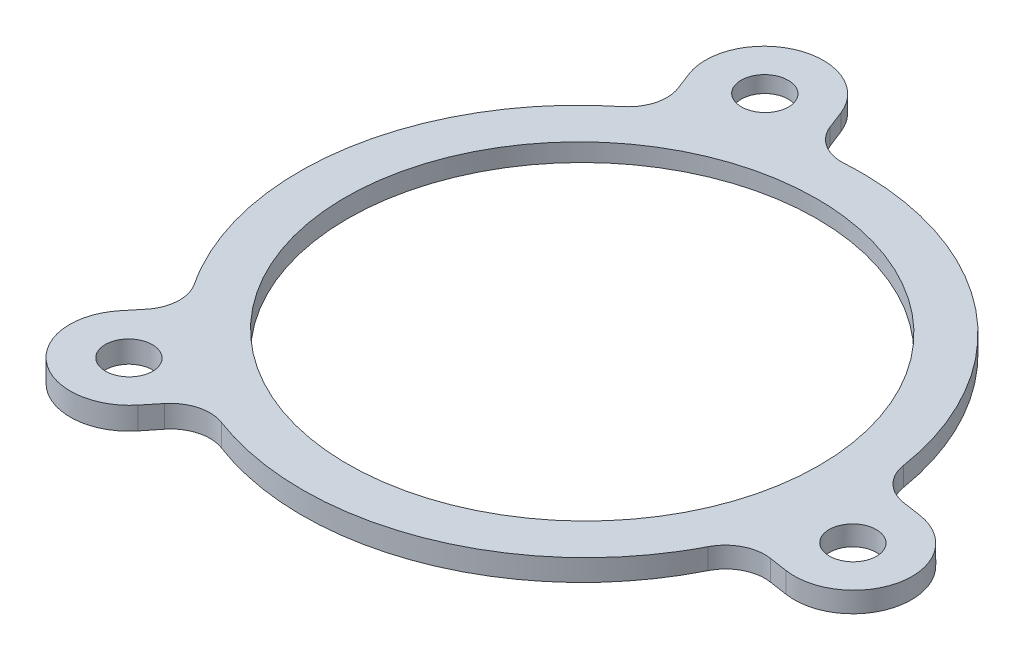
ISO-10303-21;
HEADER;
FILE_DESCRIPTION(('STEP AP214'),'2;1');
FILE_NAME('part.step','',(''),(''),'','','');
FILE_SCHEMA(('AUTOMOTIVE_DESIGN { 1 0 10303 214 1 1 1 1 }'));
ENDSEC;
DATA;
#1=APPLICATION_CONTEXT('core data for automotive mechanical design processes');
#2=APPLICATION_PROTOCOL_DEFINITION('international standard','automotive_design',2000,#1);
#3=PRODUCT_CONTEXT('',#1,'mechanical');
#4=PRODUCT('Part','Part','',(#3));
#5=PRODUCT_RELATED_PRODUCT_CATEGORY('part','',(#4));
#6=PRODUCT_DEFINITION_FORMATION('','',#4);
#7=PRODUCT_DEFINITION_CONTEXT('part definition',#1,'design');
#8=PRODUCT_DEFINITION('design','',#6,#7);
#9=PRODUCT_DEFINITION_SHAPE('','',#8);
#10=(LENGTH_UNIT() NAMED_UNIT(*) SI_UNIT(.MILLI.,.METRE.));
#11=(NAMED_UNIT(*) PLANE_ANGLE_UNIT() SI_UNIT($,.RADIAN.));
#12=(NAMED_UNIT(*) SI_UNIT($,.STERADIAN.) SOLID_ANGLE_UNIT());
#13=UNCERTAINTY_MEASURE_WITH_UNIT(LENGTH_MEASURE(1.E-05),#10,'distance_accuracy_value','');
#14=(GEOMETRIC_REPRESENTATION_CONTEXT(3) GLOBAL_UNCERTAINTY_ASSIGNED_CONTEXT((#13)) GLOBAL_UNIT_ASSIGNED_CONTEXT((#10,
#11,#12)) REPRESENTATION_CONTEXT('',''));
#15=CARTESIAN_POINT('',(0.,0.,0.));
#16=DIRECTION('',(0.,0.,1.));
#17=DIRECTION('',(1.,0.,0.));
#18=AXIS2_PLACEMENT_3D('',#15,#16,#17);
#19=CARTESIAN_POINT('',(-6.0204669415708,48.9962951753156,-15.3624209617317));
#20=DIRECTION('',(0.,-1.,0.));
#21=DIRECTION('',(0.,0.,-1.));
#22=AXIS2_PLACEMENT_3D('',#19,#20,#21);
#23=CYLINDRICAL_SURFACE('',#22,1.2);
#24=CARTESIAN_POINT('',(-6.0204669415708,0.,-15.3624209617317));
#25=DIRECTION('',(0.,1.,0.));
#26=DIRECTION('',(0.,0.,1.));
#27=AXIS2_PLACEMENT_3D('',#24,#25,#26);
#28=CIRCLE('',#27,1.2);
#29=CARTESIAN_POINT('',(-6.0204669415708,0.,-14.1624209617317));
#30=VERTEX_POINT('',#29);
#31=EDGE_CURVE('E244',#30,#30,#28,.T.);
#32=ORIENTED_EDGE('',*,*,#31,.F.);
#33=EDGE_LOOP('',(#32));
#34=FACE_BOUND('',#33,.T.);
#35=CARTESIAN_POINT('',(-6.0204669415708,0.847163806580779,-15.3624209617317));
#36=DIRECTION('',(0.,0.999950515308284,-0.00994821263836066));
#37=DIRECTION('',(0.,-0.00994821263836066,-0.999950515308284));
#38=AXIS2_PLACEMENT_3D('',#35,#36,#37);
#39=ELLIPSE('',#38,1.20005938456869,1.2);
#40=CARTESIAN_POINT('',(-6.0204669415708,0.83522536064443,-16.5624209617317));
#41=VERTEX_POINT('',#40);
#42=EDGE_CURVE('E191',#41,#41,#39,.T.);
#43=ORIENTED_EDGE('',*,*,#42,.T.);
#44=EDGE_LOOP('',(#43));
#45=FACE_BOUND('',#44,.T.);
#46=ADVANCED_FACE('F41',(#34,#45),#23,.F.);
#47=CARTESIAN_POINT('',(-3.22729949398321,48.9962951753156,-16.4570513147446));
#48=DIRECTION('',(-0.931055815862527,0.,0.364876784337624));
#49=DIRECTION('',(0.364876784337624,0.,0.931055815862527));
#50=AXIS2_PLACEMENT_3D('',#47,#48,#49);
#51=PLANE('',#50);
#52=DIRECTION('',(-0.364861132229939,-0.00926240225514885,-0.931015876391134));
#53=VECTOR('',#52,1.);
#54=CARTESIAN_POINT('',(-3.06454315520295,0.8404054013402,-16.0417460876254));
#55=LINE('',#54,#53);
#56=CARTESIAN_POINT('',(-2.87443070108355,0.845231615667291,-15.5566362815929));
#57=VERTEX_POINT('',#56);
#58=CARTESIAN_POINT('',(-3.22729949398322,0.836273652172661,-16.4570513147446));
#59=VERTEX_POINT('',#58);
#60=EDGE_CURVE('E170',#57,#59,#55,.T.);
#61=ORIENTED_EDGE('',*,*,#60,.F.);
#62=DIRECTION('',(0.,-1.,0.));
#63=VECTOR('',#62,1.);
#64=CARTESIAN_POINT('',(-2.87443070108355,48.9962951753156,-15.5566362815929));
#65=LINE('',#64,#63);
#66=CARTESIAN_POINT('',(-2.87443070108355,0.,-15.5566362815929));
#67=VERTEX_POINT('',#66);
#68=EDGE_CURVE('E57',#57,#67,#65,.T.);
#69=ORIENTED_EDGE('',*,*,#68,.T.);
#70=DIRECTION('',(-0.364876784337624,0.,-0.931055815862527));
#71=VECTOR('',#70,1.);
#72=CARTESIAN_POINT('',(-3.22729949398321,0.,-16.4570513147446));
#73=LINE('',#72,#71);
#74=CARTESIAN_POINT('',(-3.22729949398321,0.,-16.4570513147446));
#75=VERTEX_POINT('',#74);
#76=EDGE_CURVE('E173',#67,#75,#73,.T.);
#77=ORIENTED_EDGE('',*,*,#76,.T.);
#78=DIRECTION('',(0.,-1.,0.));
#79=VECTOR('',#78,1.);
#80=CARTESIAN_POINT('',(-3.22729949398321,48.9962951753156,-16.4570513147446));
#81=LINE('',#80,#79);
#82=EDGE_CURVE('E166',#59,#75,#81,.T.);
#83=ORIENTED_EDGE('',*,*,#82,.F.);
#84=EDGE_LOOP('',(#61,#69,#77,#83));
#85=FACE_BOUND('',#84,.T.);
#86=ADVANCED_FACE('F168',(#85),#51,.F.);
#87=CARTESIAN_POINT('',(-1.0123190693585,48.9962951753156,-16.2863898502682));
#88=DIRECTION('',(0.,-1.,0.));
#89=DIRECTION('',(0.,0.,-1.));
#90=AXIS2_PLACEMENT_3D('',#87,#88,#89);
#91=CYLINDRICAL_SURFACE('',#90,2.);
#92=CARTESIAN_POINT('',(-1.0123190693585,0.837971512728561,-16.2863898502682));
#93=DIRECTION('',(0.,0.999950515308284,-0.00994821263836066));
#94=DIRECTION('',(0.,-0.00994821263836066,-0.999950515308284));
#95=AXIS2_PLACEMENT_3D('',#92,#93,#94);
#96=ELLIPSE('',#95,2.00009897428114,2.);
#97=CARTESIAN_POINT('',(-0.888243794181388,0.857830596443614,-14.2902422289511));
#98=VERTEX_POINT('',#97);
#99=EDGE_CURVE('E185',#98,#57,#96,.F.);
#100=ORIENTED_EDGE('',*,*,#99,.F.);
#101=DIRECTION('',(0.,-1.,0.));
#102=VECTOR('',#101,1.);
#103=CARTESIAN_POINT('',(-0.888243794181388,48.9962951753156,-14.2902422289511));
#104=LINE('',#103,#102);
#105=CARTESIAN_POINT('',(-0.888243794181388,0.,-14.2902422289511));
#106=VERTEX_POINT('',#105);
#107=EDGE_CURVE('E304',#98,#106,#104,.T.);
#108=ORIENTED_EDGE('',*,*,#107,.T.);
#109=CARTESIAN_POINT('',(-1.0123190693585,0.,-16.2863898502682));
#110=DIRECTION('',(0.,-1.,0.));
#111=DIRECTION('',(0.,0.,-1.));
#112=AXIS2_PLACEMENT_3D('',#109,#110,#111);
#113=CIRCLE('',#112,2.);
#114=EDGE_CURVE('E300',#106,#67,#113,.T.);
#115=ORIENTED_EDGE('',*,*,#114,.T.);
#116=ORIENTED_EDGE('',*,*,#68,.F.);
#117=EDGE_LOOP('',(#100,#108,#115,#116));
#118=FACE_BOUND('',#117,.T.);
#119=ADVANCED_FACE('F394',(#118),#91,.F.);
#120=CARTESIAN_POINT('',(0.,48.9962951753156,0.));
#121=DIRECTION('',(0.,-1.,0.));
#122=DIRECTION('',(0.,0.,-1.));
#123=AXIS2_PLACEMENT_3D('',#120,#121,#122);
#124=CYLINDRICAL_SURFACE('',#123,14.3178210632764);
#125=CARTESIAN_POINT('',(0.,1.00000000000001,0.));
#126=DIRECTION('',(0.,0.999950515308284,-0.00994821263836066));
#127=DIRECTION('',(0.,-0.00994821263836066,-0.999950515308284));
#128=AXIS2_PLACEMENT_3D('',#125,#126,#127);
#129=ELLIPSE('',#128,14.3185296113,14.3178210632764);
#130=CARTESIAN_POINT('',(14.1319095605525,0.977119855603566,-2.29981133408054));
#131=VERTEX_POINT('',#130);
#132=EDGE_CURVE('E188',#131,#98,#129,.T.);
#133=ORIENTED_EDGE('',*,*,#132,.F.);
#134=DIRECTION('',(0.,-1.,0.));
#135=VECTOR('',#134,1.);
#136=CARTESIAN_POINT('',(14.1319095605525,48.9962951753156,-2.29981133408054));
#137=LINE('',#136,#135);
#138=CARTESIAN_POINT('',(14.1319095605525,0.,-2.29981133408054));
#139=VERTEX_POINT('',#138);
#140=EDGE_CURVE('E306',#131,#139,#137,.T.);
#141=ORIENTED_EDGE('',*,*,#140,.T.);
#142=CARTESIAN_POINT('',(0.,0.,0.));
#143=DIRECTION('',(0.,1.,0.));
#144=DIRECTION('',(0.,0.,-1.));
#145=AXIS2_PLACEMENT_3D('',#142,#143,#144);
#146=CIRCLE('',#145,14.3178210632764);
#147=EDGE_CURVE('E297',#139,#106,#146,.T.);
#148=ORIENTED_EDGE('',*,*,#147,.T.);
#149=ORIENTED_EDGE('',*,*,#107,.F.);
#150=EDGE_LOOP('',(#133,#141,#148,#149));
#151=FACE_BOUND('',#150,.T.);
#152=ADVANCED_FACE('F391',(#151),#124,.T.);
#153=CARTESIAN_POINT('',(16.1059403153856,48.9962951753156,-2.62106291613576));
#154=DIRECTION('',(0.,-1.,0.));
#155=DIRECTION('',(0.,0.,-1.));
#156=AXIS2_PLACEMENT_3D('',#153,#154,#155);
#157=CYLINDRICAL_SURFACE('',#156,2.);
#158=CARTESIAN_POINT('',(16.1059403153856,0.97392381839996,-2.62106291613576));
#159=DIRECTION('',(0.,0.999950515308284,-0.00994821263836066));
#160=DIRECTION('',(0.,-0.00994821263836066,-0.999950515308284));
#161=AXIS2_PLACEMENT_3D('',#158,#159,#160);
#162=ELLIPSE('',#161,2.00009897428114,2.);
#163=CARTESIAN_POINT('',(15.8068696284982,0.993597509398876,-0.643550154041748));
#164=VERTEX_POINT('',#163);
#165=EDGE_CURVE('E196',#164,#131,#162,.F.);
#166=ORIENTED_EDGE('',*,*,#165,.F.);
#167=DIRECTION('',(0.,-1.,0.));
#168=VECTOR('',#167,1.);
#169=CARTESIAN_POINT('',(15.8068696284982,48.9962951753156,-0.643550154041748));
#170=LINE('',#169,#168);
#171=CARTESIAN_POINT('',(15.8068696284982,0.,-0.643550154041748));
#172=VERTEX_POINT('',#171);
#173=EDGE_CURVE('E308',#164,#172,#170,.T.);
#174=ORIENTED_EDGE('',*,*,#173,.T.);
#175=CARTESIAN_POINT('',(16.1059403153856,0.,-2.62106291613576));
#176=DIRECTION('',(0.,-1.,0.));
#177=DIRECTION('',(0.,0.,-1.));
#178=AXIS2_PLACEMENT_3D('',#175,#176,#177);
#179=CIRCLE('',#178,2.);
#180=EDGE_CURVE('E294',#172,#139,#179,.T.);
#181=ORIENTED_EDGE('',*,*,#180,.T.);
#182=ORIENTED_EDGE('',*,*,#140,.F.);
#183=EDGE_LOOP('',(#166,#174,#181,#182));
#184=FACE_BOUND('',#183,.T.);
#185=ADVANCED_FACE('F387',(#184),#157,.F.);
#186=CARTESIAN_POINT('',(16.7630863176067,48.9962951753156,-0.498935976319788));
#187=DIRECTION('',(-0.149535343443711,0.,0.988756381047006));
#188=DIRECTION('',(0.988756381047006,0.,0.149535343443711));
#189=AXIS2_PLACEMENT_3D('',#186,#187,#188);
#190=PLANE('',#189);
#191=DIRECTION('',(-0.988755286890644,-0.00148768136479566,-0.149535177968119));
#192=VECTOR('',#191,1.);
#193=CARTESIAN_POINT('',(16.8336939045544,0.995142469370929,-0.488257582767704));
#194=LINE('',#193,#192);
#195=CARTESIAN_POINT('',(16.7630863176067,0.995036233184182,-0.498935976319788));
#196=VERTEX_POINT('',#195);
#197=EDGE_CURVE('E199',#196,#164,#194,.T.);
#198=ORIENTED_EDGE('',*,*,#197,.F.);
#199=DIRECTION('',(0.,-1.,0.));
#200=VECTOR('',#199,1.);
#201=CARTESIAN_POINT('',(16.7630863176067,48.9962951753156,-0.498935976319787));
#202=LINE('',#201,#200);
#203=CARTESIAN_POINT('',(16.7630863176067,0.,-0.498935976319787));
#204=VERTEX_POINT('',#203);
#205=EDGE_CURVE('E310',#196,#204,#202,.T.);
#206=ORIENTED_EDGE('',*,*,#205,.T.);
#207=DIRECTION('',(-0.988756381047006,0.,-0.149535343443711));
#208=VECTOR('',#207,1.);
#209=CARTESIAN_POINT('',(16.7630863176067,0.,-0.498935976319788));
#210=LINE('',#209,#208);
#211=EDGE_CURVE('E291',#204,#172,#210,.T.);
#212=ORIENTED_EDGE('',*,*,#211,.T.);
#213=ORIENTED_EDGE('',*,*,#173,.F.);
#214=EDGE_LOOP('',(#198,#206,#212,#213));
#215=FACE_BOUND('',#214,.T.);
#216=ADVANCED_FACE('F384',(#215),#190,.F.);
#217=CARTESIAN_POINT('',(16.3144802872756,48.9962951753156,2.46733316682123));
#218=DIRECTION('',(0.,-1.,0.));
#219=DIRECTION('',(0.,0.,-1.));
#220=AXIS2_PLACEMENT_3D('',#217,#218,#219);
#221=CYLINDRICAL_SURFACE('',#220,3.);
#222=CARTESIAN_POINT('',(16.3144802872756,1.02454676968255,2.46733316682123));
#223=DIRECTION('',(0.,0.999950515308284,-0.00994821263836066));
#224=DIRECTION('',(0.,-0.00994821263836066,-0.999950515308284));
#225=AXIS2_PLACEMENT_3D('',#222,#223,#224);
#226=ELLIPSE('',#225,3.00014846142171,3.);
#227=CARTESIAN_POINT('',(15.8658742569445,1.05405730618093,5.43360230996224));
#228=VERTEX_POINT('',#227);
#229=EDGE_CURVE('E202',#228,#196,#226,.T.);
#230=ORIENTED_EDGE('',*,*,#229,.F.);
#231=DIRECTION('',(0.,-1.,0.));
#232=VECTOR('',#231,1.);
#233=CARTESIAN_POINT('',(15.8658742569445,48.9962951753156,5.43360230996224));
#234=LINE('',#233,#232);
#235=CARTESIAN_POINT('',(15.8658742569445,0.,5.43360230996224));
#236=VERTEX_POINT('',#235);
#237=EDGE_CURVE('E312',#228,#236,#234,.T.);
#238=ORIENTED_EDGE('',*,*,#237,.T.);
#239=CARTESIAN_POINT('',(16.3144802872756,0.,2.46733316682123));
#240=DIRECTION('',(0.,1.,0.));
#241=DIRECTION('',(0.,0.,-1.));
#242=AXIS2_PLACEMENT_3D('',#239,#240,#241);
#243=CIRCLE('',#242,3.);
#244=EDGE_CURVE('E288',#236,#204,#243,.T.);
#245=ORIENTED_EDGE('',*,*,#244,.T.);
#246=ORIENTED_EDGE('',*,*,#205,.F.);
#247=EDGE_LOOP('',(#230,#238,#245,#246));
#248=FACE_BOUND('',#247,.T.);
#249=ADVANCED_FACE('F379',(#248),#221,.T.);
#250=CARTESIAN_POINT('',(15.8658742569445,48.9962951753156,5.43360230996224));
#251=DIRECTION('',(0.149535343443709,0.,-0.988756381047006));
#252=DIRECTION('',(-0.988756381047006,0.,-0.149535343443709));
#253=AXIS2_PLACEMENT_3D('',#250,#251,#252);
#254=PLANE('',#253);
#255=DIRECTION('',(0.988755286890644,0.00148768136479565,0.149535177968118));
#256=VECTOR('',#255,1.);
#257=CARTESIAN_POINT('',(15.9363950266787,1.05416341174249,5.44426757364525));
#258=LINE('',#257,#256);
#259=CARTESIAN_POINT('',(14.9096575678359,1.05261858239563,5.28898813224028));
#260=VERTEX_POINT('',#259);
#261=EDGE_CURVE('E205',#260,#228,#258,.T.);
#262=ORIENTED_EDGE('',*,*,#261,.F.);
#263=DIRECTION('',(0.,-1.,0.));
#264=VECTOR('',#263,1.);
#265=CARTESIAN_POINT('',(14.9096575678359,48.9962951753156,5.28898813224028));
#266=LINE('',#265,#264);
#267=CARTESIAN_POINT('',(14.9096575678359,0.,5.28898813224028));
#268=VERTEX_POINT('',#267);
#269=EDGE_CURVE('E314',#260,#268,#266,.T.);
#270=ORIENTED_EDGE('',*,*,#269,.T.);
#271=DIRECTION('',(0.988756381047006,0.,0.149535343443709));
#272=VECTOR('',#271,1.);
#273=CARTESIAN_POINT('',(15.8658742569445,0.,5.43360230996224));
#274=LINE('',#273,#272);
#275=EDGE_CURVE('E284',#268,#236,#274,.T.);
#276=ORIENTED_EDGE('',*,*,#275,.T.);
#277=ORIENTED_EDGE('',*,*,#237,.F.);
#278=EDGE_LOOP('',(#262,#270,#276,#277));
#279=FACE_BOUND('',#278,.T.);
#280=ADVANCED_FACE('F375',(#279),#254,.F.);
#281=CARTESIAN_POINT('',(14.6105868809485,48.9962951753156,7.2665008943343));
#282=DIRECTION('',(0.,-1.,0.));
#283=DIRECTION('',(0.,0.,-1.));
#284=AXIS2_PLACEMENT_3D('',#281,#282,#283);
#285=CYLINDRICAL_SURFACE('',#284,2.);
#286=CARTESIAN_POINT('',(14.6105868809485,1.07229227339455,7.2665008943343));
#287=DIRECTION('',(0.,0.999950515308284,-0.00994821263836066));
#288=DIRECTION('',(0.,-0.00994821263836066,-0.999950515308284));
#289=AXIS2_PLACEMENT_3D('',#286,#287,#288);
#290=ELLIPSE('',#289,2.00009897428114,2.);
#291=CARTESIAN_POINT('',(12.8198346935955,1.06343174316637,6.37587942396069));
#292=VERTEX_POINT('',#291);
#293=EDGE_CURVE('E209',#292,#260,#290,.F.);
#294=ORIENTED_EDGE('',*,*,#293,.F.);
#295=DIRECTION('',(0.,-1.,0.));
#296=VECTOR('',#295,1.);
#297=CARTESIAN_POINT('',(12.8198346935955,48.9962951753156,6.37587942396069));
#298=LINE('',#297,#296);
#299=CARTESIAN_POINT('',(12.8198346935955,0.,6.37587942396069));
#300=VERTEX_POINT('',#299);
#301=EDGE_CURVE('E316',#292,#300,#298,.T.);
#302=ORIENTED_EDGE('',*,*,#301,.T.);
#303=CARTESIAN_POINT('',(14.6105868809485,0.,7.2665008943343));
#304=DIRECTION('',(0.,-1.,0.));
#305=DIRECTION('',(0.,0.,-1.));
#306=AXIS2_PLACEMENT_3D('',#303,#304,#305);
#307=CIRCLE('',#306,2.);
#308=EDGE_CURVE('E281',#300,#268,#307,.T.);
#309=ORIENTED_EDGE('',*,*,#308,.T.);
#310=ORIENTED_EDGE('',*,*,#269,.F.);
#311=EDGE_LOOP('',(#294,#302,#309,#310));
#312=FACE_BOUND('',#311,.T.);
#313=ADVANCED_FACE('F372',(#312),#285,.F.);
#314=CARTESIAN_POINT('',(0.,48.9962951753156,0.));
#315=DIRECTION('',(0.,-1.,0.));
#316=DIRECTION('',(0.,0.,-1.));
#317=AXIS2_PLACEMENT_3D('',#314,#315,#316);
#318=CYLINDRICAL_SURFACE('',#317,14.3178210632764);
#319=CARTESIAN_POINT('',(0.,1.00000000000001,0.));
#320=DIRECTION('',(0.,0.999950515308284,-0.00994821263836066));
#321=DIRECTION('',(0.,-0.00994821263836066,-0.999950515308284));
#322=AXIS2_PLACEMENT_3D('',#319,#320,#321);
#323=ELLIPSE('',#322,14.3185296113,14.3178210632764);
#324=CARTESIAN_POINT('',(-5.07425974105116,1.13319821977159,13.3884983504629));
#325=VERTEX_POINT('',#324);
#326=EDGE_CURVE('E212',#325,#292,#323,.T.);
#327=ORIENTED_EDGE('',*,*,#326,.F.);
#328=DIRECTION('',(0.,-1.,0.));
#329=VECTOR('',#328,1.);
#330=CARTESIAN_POINT('',(-5.07425974105116,48.9962951753156,13.3884983504629));
#331=LINE('',#330,#329);
#332=CARTESIAN_POINT('',(-5.07425974105116,0.,13.3884983504629));
#333=VERTEX_POINT('',#332);
#334=EDGE_CURVE('E318',#325,#333,#331,.T.);
#335=ORIENTED_EDGE('',*,*,#334,.T.);
#336=CARTESIAN_POINT('',(0.,0.,0.));
#337=DIRECTION('',(0.,1.,0.));
#338=DIRECTION('',(0.,0.,-1.));
#339=AXIS2_PLACEMENT_3D('',#336,#337,#338);
#340=CIRCLE('',#339,14.3178210632764);
#341=EDGE_CURVE('E278',#333,#300,#340,.T.);
#342=ORIENTED_EDGE('',*,*,#341,.T.);
#343=ORIENTED_EDGE('',*,*,#301,.F.);
#344=EDGE_LOOP('',(#327,#335,#342,#343));
#345=FACE_BOUND('',#344,.T.);
#346=ADVANCED_FACE('F367',(#345),#318,.T.);
#347=CARTESIAN_POINT('',(-5.78306308740197,48.9962951753156,15.2586849230277));
#348=DIRECTION('',(0.,-1.,0.));
#349=DIRECTION('',(0.,0.,-1.));
#350=AXIS2_PLACEMENT_3D('',#347,#348,#349);
#351=CYLINDRICAL_SURFACE('',#350,2.);
#352=CARTESIAN_POINT('',(-5.78306308740197,1.1518041541778,15.2586849230277));
#353=DIRECTION('',(0.,0.999950515308284,-0.00994821263836066));
#354=DIRECTION('',(0.,-0.00994821263836066,-0.999950515308284));
#355=AXIS2_PLACEMENT_3D('',#352,#353,#354);
#356=ELLIPSE('',#355,2.00009897428114,2.);
#357=CARTESIAN_POINT('',(-7.3461040322396,1.13939056611763,14.010925729609));
#358=VERTEX_POINT('',#357);
#359=EDGE_CURVE('E215',#358,#325,#356,.F.);
#360=ORIENTED_EDGE('',*,*,#359,.F.);
#361=DIRECTION('',(0.,-1.,0.));
#362=VECTOR('',#361,1.);
#363=CARTESIAN_POINT('',(-7.3461040322396,48.9962951753156,14.010925729609));
#364=LINE('',#363,#362);
#365=CARTESIAN_POINT('',(-7.3461040322396,0.,14.010925729609));
#366=VERTEX_POINT('',#365);
#367=EDGE_CURVE('E320',#358,#366,#364,.T.);
#368=ORIENTED_EDGE('',*,*,#367,.T.);
#369=CARTESIAN_POINT('',(-5.78306308740197,0.,15.2586849230277));
#370=DIRECTION('',(0.,-1.,0.));
#371=DIRECTION('',(0.,0.,-1.));
#372=AXIS2_PLACEMENT_3D('',#369,#370,#371);
#373=CIRCLE('',#372,2.);
#374=EDGE_CURVE('E275',#366,#333,#373,.T.);
#375=ORIENTED_EDGE('',*,*,#374,.T.);
#376=ORIENTED_EDGE('',*,*,#334,.F.);
#377=EDGE_LOOP('',(#360,#368,#375,#376));
#378=FACE_BOUND('',#377,.T.);
#379=ADVANCED_FACE('F363',(#378),#351,.F.);
#380=CARTESIAN_POINT('',(-7.94945192844849,48.9962951753156,14.7667265850386));
#381=DIRECTION('',(-0.781520472418816,0.,-0.62387959670939));
#382=DIRECTION('',(-0.62387959670939,0.,0.781520472418816));
#383=AXIS2_PLACEMENT_3D('',#380,#381,#382);
#384=PLANE('',#383);
#385=DIRECTION('',(0.623860740043018,-0.00777488158837998,-0.781496851080838));
#386=VECTOR('',#385,1.);
#387=CARTESIAN_POINT('',(-8.1815426630215,1.14980224297397,15.0574616266784));
#388=LINE('',#387,#386);
#389=CARTESIAN_POINT('',(-7.94945192844849,1.14690980582695,14.7667265850386));
#390=VERTEX_POINT('',#389);
#391=EDGE_CURVE('E218',#390,#358,#388,.T.);
#392=ORIENTED_EDGE('',*,*,#391,.F.);
#393=DIRECTION('',(0.,-1.,0.));
#394=VECTOR('',#393,1.);
#395=CARTESIAN_POINT('',(-7.94945192844849,48.9962951753156,14.7667265850386));
#396=LINE('',#395,#394);
#397=CARTESIAN_POINT('',(-7.94945192844849,0.,14.7667265850386));
#398=VERTEX_POINT('',#397);
#399=EDGE_CURVE('E322',#390,#398,#396,.T.);
#400=ORIENTED_EDGE('',*,*,#399,.T.);
#401=DIRECTION('',(0.62387959670939,0.,-0.781520472418816));
#402=VECTOR('',#401,1.);
#403=CARTESIAN_POINT('',(-7.94945192844849,0.,14.7667265850386));
#404=LINE('',#403,#402);
#405=EDGE_CURVE('E271',#398,#366,#404,.T.);
#406=ORIENTED_EDGE('',*,*,#405,.T.);
#407=ORIENTED_EDGE('',*,*,#367,.F.);
#408=EDGE_LOOP('',(#392,#400,#406,#407));
#409=FACE_BOUND('',#408,.T.);
#410=ADVANCED_FACE('F360',(#409),#384,.F.);
#411=CARTESIAN_POINT('',(-10.2940133457049,48.9962951753156,12.8950877949105));
#412=DIRECTION('',(0.,-1.,0.));
#413=DIRECTION('',(0.,0.,-1.));
#414=AXIS2_PLACEMENT_3D('',#411,#412,#413);
#415=CYLINDRICAL_SURFACE('',#414,3.);
#416=CARTESIAN_POINT('',(-10.2940133457049,1.12828942373668,12.8950877949105));
#417=DIRECTION('',(0.,0.999950515308284,-0.00994821263836066));
#418=DIRECTION('',(0.,-0.00994821263836066,-0.999950515308284));
#419=AXIS2_PLACEMENT_3D('',#416,#417,#418);
#420=ELLIPSE('',#419,3.00014846142172,3.);
#421=CARTESIAN_POINT('',(-12.6385747629614,1.10966904164642,11.0234490047823));
#422=VERTEX_POINT('',#421);
#423=EDGE_CURVE('E222',#422,#390,#420,.T.);
#424=ORIENTED_EDGE('',*,*,#423,.F.);
#425=DIRECTION('',(0.,-1.,0.));
#426=VECTOR('',#425,1.);
#427=CARTESIAN_POINT('',(-12.6385747629614,48.9962951753156,11.0234490047823));
#428=LINE('',#427,#426);
#429=CARTESIAN_POINT('',(-12.6385747629614,0.,11.0234490047823));
#430=VERTEX_POINT('',#429);
#431=EDGE_CURVE('E324',#422,#430,#428,.T.);
#432=ORIENTED_EDGE('',*,*,#431,.T.);
#433=CARTESIAN_POINT('',(-10.2940133457049,0.,12.8950877949105));
#434=DIRECTION('',(0.,1.,0.));
#435=DIRECTION('',(0.,0.,-1.));
#436=AXIS2_PLACEMENT_3D('',#433,#434,#435);
#437=CIRCLE('',#436,3.);
#438=EDGE_CURVE('E268',#430,#398,#437,.T.);
#439=ORIENTED_EDGE('',*,*,#438,.T.);
#440=ORIENTED_EDGE('',*,*,#399,.F.);
#441=EDGE_LOOP('',(#424,#432,#439,#440));
#442=FACE_BOUND('',#441,.T.);
#443=ADVANCED_FACE('F355',(#442),#415,.T.);
#444=CARTESIAN_POINT('',(-12.6385747629614,48.9962951753156,11.0234490047823));
#445=DIRECTION('',(0.781520472418816,0.,0.623879596709389));
#446=DIRECTION('',(0.623879596709389,0.,-0.781520472418816));
#447=AXIS2_PLACEMENT_3D('',#444,#445,#446);
#448=PLANE('',#447);
#449=DIRECTION('',(-0.623860740043017,0.00777488158837999,0.781496851080838));
#450=VECTOR('',#449,1.);
#451=CARTESIAN_POINT('',(-12.8708461317525,1.11256372995233,11.3144103229989));
#452=LINE('',#451,#450);
#453=CARTESIAN_POINT('',(-12.0352268667525,1.10214980193709,10.2676481493526));
#454=VERTEX_POINT('',#453);
#455=EDGE_CURVE('E225',#454,#422,#452,.T.);
#456=ORIENTED_EDGE('',*,*,#455,.F.);
#457=DIRECTION('',(0.,-1.,0.));
#458=VECTOR('',#457,1.);
#459=CARTESIAN_POINT('',(-12.0352268667525,48.9962951753156,10.2676481493526));
#460=LINE('',#459,#458);
#461=CARTESIAN_POINT('',(-12.0352268667525,0.,10.2676481493526));
#462=VERTEX_POINT('',#461);
#463=EDGE_CURVE('E326',#454,#462,#460,.T.);
#464=ORIENTED_EDGE('',*,*,#463,.T.);
#465=DIRECTION('',(-0.623879596709389,0.,0.781520472418816));
#466=VECTOR('',#465,1.);
#467=CARTESIAN_POINT('',(-12.6385747629614,0.,11.0234490047823));
#468=LINE('',#467,#466);
#469=EDGE_CURVE('E264',#462,#430,#468,.T.);
#470=ORIENTED_EDGE('',*,*,#469,.T.);
#471=ORIENTED_EDGE('',*,*,#431,.F.);
#472=EDGE_LOOP('',(#456,#464,#470,#471));
#473=FACE_BOUND('',#472,.T.);
#474=ADVANCED_FACE('F351',(#473),#448,.F.);
#475=CARTESIAN_POINT('',(-13.5982678115901,48.9962951753156,9.01988895593385));
#476=DIRECTION('',(0.,-1.,0.));
#477=DIRECTION('',(0.,0.,-1.));
#478=AXIS2_PLACEMENT_3D('',#475,#476,#477);
#479=CYLINDRICAL_SURFACE('',#478,2.);
#480=CARTESIAN_POINT('',(-13.5982678115901,1.08973621387692,9.01988895593385));
#481=DIRECTION('',(0.,0.999950515308284,-0.00994821263836066));
#482=DIRECTION('',(0.,-0.00994821263836066,-0.999950515308284));
#483=AXIS2_PLACEMENT_3D('',#480,#481,#482);
#484=ELLIPSE('',#483,2.00009897428114,2.);
#485=CARTESIAN_POINT('',(-11.9315908994142,1.07873766039003,7.91436280499041));
#486=VERTEX_POINT('',#485);
#487=EDGE_CURVE('E229',#486,#454,#484,.F.);
#488=ORIENTED_EDGE('',*,*,#487,.F.);
#489=DIRECTION('',(0.,-1.,0.));
#490=VECTOR('',#489,1.);
#491=CARTESIAN_POINT('',(-11.9315908994142,48.9962951753156,7.91436280499041));
#492=LINE('',#491,#490);
#493=CARTESIAN_POINT('',(-11.9315908994142,0.,7.91436280499041));
#494=VERTEX_POINT('',#493);
#495=EDGE_CURVE('E328',#486,#494,#492,.T.);
#496=ORIENTED_EDGE('',*,*,#495,.T.);
#497=CARTESIAN_POINT('',(-13.5982678115901,0.,9.01988895593385));
#498=DIRECTION('',(0.,-1.,0.));
#499=DIRECTION('',(0.,0.,-1.));
#500=AXIS2_PLACEMENT_3D('',#497,#498,#499);
#501=CIRCLE('',#500,2.);
#502=EDGE_CURVE('E261',#494,#462,#501,.T.);
#503=ORIENTED_EDGE('',*,*,#502,.T.);
#504=ORIENTED_EDGE('',*,*,#463,.F.);
#505=EDGE_LOOP('',(#488,#496,#503,#504));
#506=FACE_BOUND('',#505,.T.);
#507=ADVANCED_FACE('F349',(#506),#479,.F.);
#508=CARTESIAN_POINT('',(0.,48.9962951753156,0.));
#509=DIRECTION('',(0.,-1.,0.));
#510=DIRECTION('',(0.,0.,-1.));
#511=AXIS2_PLACEMENT_3D('',#508,#509,#510);
#512=CYLINDRICAL_SURFACE('',#511,14.3178210632764);
#513=CARTESIAN_POINT('',(0.,1.00000000000001,0.));
#514=DIRECTION('',(0.,0.999950515308284,-0.00994821263836066));
#515=DIRECTION('',(0.,-0.00994821263836066,-0.999950515308284));
#516=AXIS2_PLACEMENT_3D('',#513,#514,#515);
#517=ELLIPSE('',#516,14.3185296113,14.3178210632764);
#518=CARTESIAN_POINT('',(-9.05764981950144,0.889681924624859,-11.0886870163823));
#519=VERTEX_POINT('',#518);
#520=EDGE_CURVE('E232',#519,#486,#517,.T.);
#521=ORIENTED_EDGE('',*,*,#520,.F.);
#522=DIRECTION('',(0.,-1.,0.));
#523=VECTOR('',#522,1.);
#524=CARTESIAN_POINT('',(-9.05764981950144,48.9962951753156,-11.0886870163823));
#525=LINE('',#524,#523);
#526=CARTESIAN_POINT('',(-9.05764981950144,0.,-11.0886870163823));
#527=VERTEX_POINT('',#526);
#528=EDGE_CURVE('E330',#519,#527,#525,.T.);
#529=ORIENTED_EDGE('',*,*,#528,.T.);
#530=CARTESIAN_POINT('',(0.,0.,0.));
#531=DIRECTION('',(0.,1.,0.));
#532=DIRECTION('',(0.,0.,-1.));
#533=AXIS2_PLACEMENT_3D('',#530,#531,#532);
#534=CIRCLE('',#533,14.3178210632764);
#535=EDGE_CURVE('E258',#527,#494,#534,.T.);
#536=ORIENTED_EDGE('',*,*,#535,.T.);
#537=ORIENTED_EDGE('',*,*,#495,.F.);
#538=EDGE_LOOP('',(#521,#529,#536,#537));
#539=FACE_BOUND('',#538,.T.);
#540=ADVANCED_FACE('F346',(#539),#512,.T.);
#541=CARTESIAN_POINT('',(-10.3228772279838,48.9962951753156,-12.6376220068919));
#542=DIRECTION('',(0.,-1.,0.));
#543=DIRECTION('',(0.,0.,-1.));
#544=AXIS2_PLACEMENT_3D('',#541,#542,#543);
#545=CYLINDRICAL_SURFACE('',#544,2.);
#546=CARTESIAN_POINT('',(-10.3228772279838,0.874272027422254,-12.6376220068919));
#547=DIRECTION('',(0.,0.999950515308284,-0.00994821263836066));
#548=DIRECTION('',(0.,-0.00994821263836066,-0.999950515308284));
#549=AXIS2_PLACEMENT_3D('',#546,#547,#548);
#550=ELLIPSE('',#549,2.00009897428114,2.);
#551=CARTESIAN_POINT('',(-8.46076559625871,0.867011924483511,-13.3673755755672));
#552=VERTEX_POINT('',#551);
#553=EDGE_CURVE('E235',#552,#519,#550,.F.);
#554=ORIENTED_EDGE('',*,*,#553,.F.);
#555=DIRECTION('',(0.,-1.,0.));
#556=VECTOR('',#555,1.);
#557=CARTESIAN_POINT('',(-8.46076559625871,48.9962951753156,-13.3673755755672));
#558=LINE('',#557,#556);
#559=CARTESIAN_POINT('',(-8.46076559625871,0.,-13.3673755755672));
#560=VERTEX_POINT('',#559);
#561=EDGE_CURVE('E50',#552,#560,#558,.T.);
#562=ORIENTED_EDGE('',*,*,#561,.T.);
#563=CARTESIAN_POINT('',(-10.3228772279838,0.,-12.6376220068919));
#564=DIRECTION('',(0.,-1.,0.));
#565=DIRECTION('',(0.,0.,1.));
#566=AXIS2_PLACEMENT_3D('',#563,#564,#565);
#567=CIRCLE('',#566,2.);
#568=EDGE_CURVE('E255',#560,#527,#567,.T.);
#569=ORIENTED_EDGE('',*,*,#568,.T.);
#570=ORIENTED_EDGE('',*,*,#528,.F.);
#571=EDGE_LOOP('',(#554,#562,#569,#570));
#572=FACE_BOUND('',#571,.T.);
#573=ADVANCED_FACE('F333',(#572),#545,.F.);
#574=CARTESIAN_POINT('',(-8.81363438915838,48.9962951753156,-14.2677906087188));
#575=DIRECTION('',(0.931055815862527,0.,-0.364876784337623));
#576=DIRECTION('',(-0.364876784337623,0.,-0.931055815862527));
#577=AXIS2_PLACEMENT_3D('',#574,#575,#576);
#578=PLANE('',#577);
#579=DIRECTION('',(0.364861132229938,0.00926240225514886,0.931015876391134));
#580=VECTOR('',#579,1.);
#581=CARTESIAN_POINT('',(-8.65095165672645,0.862183841578087,-13.8526732028633));
#582=LINE('',#581,#580);
#583=CARTESIAN_POINT('',(-8.81363438915838,0.858053960988877,-14.2677906087188));
#584=VERTEX_POINT('',#583);
#585=EDGE_CURVE('E64',#584,#552,#582,.T.);
#586=ORIENTED_EDGE('',*,*,#585,.F.);
#587=DIRECTION('',(0.,-1.,0.));
#588=VECTOR('',#587,1.);
#589=CARTESIAN_POINT('',(-8.81363438915838,48.9962951753156,-14.2677906087188));
#590=LINE('',#589,#588);
#591=CARTESIAN_POINT('',(-8.81363438915838,0.,-14.2677906087188));
#592=VERTEX_POINT('',#591);
#593=EDGE_CURVE('E11',#584,#592,#590,.T.);
#594=ORIENTED_EDGE('',*,*,#593,.T.);
#595=DIRECTION('',(0.364876784337623,0.,0.931055815862527));
#596=VECTOR('',#595,1.);
#597=CARTESIAN_POINT('',(-8.81363438915838,0.,-14.2677906087188));
#598=LINE('',#597,#596);
#599=EDGE_CURVE('E252',#592,#560,#598,.T.);
#600=ORIENTED_EDGE('',*,*,#599,.T.);
#601=ORIENTED_EDGE('',*,*,#561,.F.);
#602=EDGE_LOOP('',(#586,#594,#600,#601));
#603=FACE_BOUND('',#602,.T.);
#604=ADVANCED_FACE('F338',(#603),#578,.F.);
#605=CARTESIAN_POINT('',(-6.0204669415708,48.9962951753156,-15.3624209617317));
#606=DIRECTION('',(0.,-1.,0.));
#607=DIRECTION('',(0.,0.,-1.));
#608=AXIS2_PLACEMENT_3D('',#605,#606,#607);
#609=CYLINDRICAL_SURFACE('',#608,3.);
#610=CARTESIAN_POINT('',(-6.0204669415708,0.847163806580779,-15.3624209617317));
#611=DIRECTION('',(0.,0.999950515308284,-0.00994821263836066));
#612=DIRECTION('',(0.,-0.00994821263836066,-0.999950515308284));
#613=AXIS2_PLACEMENT_3D('',#610,#611,#612);
#614=ELLIPSE('',#613,3.00014846142172,3.);
#615=EDGE_CURVE('E179',#59,#584,#614,.T.);
#616=ORIENTED_EDGE('',*,*,#615,.F.);
#617=ORIENTED_EDGE('',*,*,#82,.T.);
#618=CARTESIAN_POINT('',(-6.0204669415708,0.,-15.3624209617317));
#619=DIRECTION('',(0.,1.,0.));
#620=DIRECTION('',(0.,0.,-1.));
#621=AXIS2_PLACEMENT_3D('',#618,#619,#620);
#622=CIRCLE('',#621,3.);
#623=EDGE_CURVE('E250',#75,#592,#622,.T.);
#624=ORIENTED_EDGE('',*,*,#623,.T.);
#625=ORIENTED_EDGE('',*,*,#593,.F.);
#626=EDGE_LOOP('',(#616,#617,#624,#625));
#627=FACE_BOUND('',#626,.T.);
#628=ADVANCED_FACE('F43',(#627),#609,.T.);
#629=CARTESIAN_POINT('',(0.,48.9962951753156,0.));
#630=DIRECTION('',(0.,-1.,0.));
#631=DIRECTION('',(0.,0.,-1.));
#632=AXIS2_PLACEMENT_3D('',#629,#630,#631);
#633=CYLINDRICAL_SURFACE('',#632,12.);
#634=CARTESIAN_POINT('',(0.,0.,0.));
#635=DIRECTION('',(0.,1.,0.));
#636=DIRECTION('',(0.,0.,1.));
#637=AXIS2_PLACEMENT_3D('',#634,#635,#636);
#638=CIRCLE('',#637,12.);
#639=CARTESIAN_POINT('',(0.,0.,12.));
#640=VERTEX_POINT('',#639);
#641=EDGE_CURVE('E247',#640,#640,#638,.T.);
#642=ORIENTED_EDGE('',*,*,#641,.F.);
#643=EDGE_LOOP('',(#642));
#644=FACE_BOUND('',#643,.T.);
#645=CARTESIAN_POINT('',(0.,1.00000000000001,0.));
#646=DIRECTION('',(0.,0.999950515308284,-0.00994821263836066));
#647=DIRECTION('',(0.,-0.00994821263836066,-0.999950515308284));
#648=AXIS2_PLACEMENT_3D('',#645,#646,#647);
#649=ELLIPSE('',#648,12.0005938456869,12.);
#650=CARTESIAN_POINT('',(0.,0.880615540636512,-12.));
#651=VERTEX_POINT('',#650);
#652=EDGE_CURVE('E186',#651,#651,#649,.T.);
#653=ORIENTED_EDGE('',*,*,#652,.T.);
#654=EDGE_LOOP('',(#653));
#655=FACE_BOUND('',#654,.T.);
#656=ADVANCED_FACE('F414',(#644,#655),#633,.F.);
#657=CARTESIAN_POINT('',(16.3144802872756,48.9962951753156,2.46733316682123));
#658=DIRECTION('',(0.,-1.,0.));
#659=DIRECTION('',(0.,0.,-1.));
#660=AXIS2_PLACEMENT_3D('',#657,#658,#659);
#661=CYLINDRICAL_SURFACE('',#660,1.2);
#662=CARTESIAN_POINT('',(16.3144802872756,0.,2.46733316682123));
#663=DIRECTION('',(0.,1.,0.));
#664=DIRECTION('',(0.,0.,1.));
#665=AXIS2_PLACEMENT_3D('',#662,#663,#664);
#666=CIRCLE('',#665,1.2);
#667=CARTESIAN_POINT('',(16.3144802872756,0.,3.66733316682123));
#668=VERTEX_POINT('',#667);
#669=EDGE_CURVE('E241',#668,#668,#666,.T.);
#670=ORIENTED_EDGE('',*,*,#669,.F.);
#671=EDGE_LOOP('',(#670));
#672=FACE_BOUND('',#671,.T.);
#673=CARTESIAN_POINT('',(16.3144802872756,1.02454676968255,2.46733316682123));
#674=DIRECTION('',(0.,0.999950515308284,-0.00994821263836066));
#675=DIRECTION('',(0.,-0.00994821263836066,-0.999950515308284));
#676=AXIS2_PLACEMENT_3D('',#673,#674,#675);
#677=ELLIPSE('',#676,1.20005938456869,1.2);
#678=CARTESIAN_POINT('',(16.3144802872756,1.01260832374621,1.26733316682123));
#679=VERTEX_POINT('',#678);
#680=EDGE_CURVE('E444',#679,#679,#677,.T.);
#681=ORIENTED_EDGE('',*,*,#680,.T.);
#682=EDGE_LOOP('',(#681));
#683=FACE_BOUND('',#682,.T.);
#684=ADVANCED_FACE('F412',(#672,#683),#661,.F.);
#685=CARTESIAN_POINT('',(-6.0204669415708,0.,-15.3624209617317));
#686=DIRECTION('',(0.,-1.,0.));
#687=DIRECTION('',(0.,0.,-1.));
#688=AXIS2_PLACEMENT_3D('',#685,#686,#687);
#689=PLANE('',#688);
#690=ORIENTED_EDGE('',*,*,#669,.T.);
#691=EDGE_LOOP('',(#690));
#692=FACE_BOUND('',#691,.T.);
#693=ORIENTED_EDGE('',*,*,#641,.T.);
#694=EDGE_LOOP('',(#693));
#695=FACE_BOUND('',#694,.T.);
#696=ORIENTED_EDGE('',*,*,#623,.F.);
#697=ORIENTED_EDGE('',*,*,#76,.F.);
#698=ORIENTED_EDGE('',*,*,#114,.F.);
#699=ORIENTED_EDGE('',*,*,#147,.F.);
#700=ORIENTED_EDGE('',*,*,#180,.F.);
#701=ORIENTED_EDGE('',*,*,#211,.F.);
#702=ORIENTED_EDGE('',*,*,#244,.F.);
#703=ORIENTED_EDGE('',*,*,#275,.F.);
#704=ORIENTED_EDGE('',*,*,#308,.F.);
#705=ORIENTED_EDGE('',*,*,#341,.F.);
#706=ORIENTED_EDGE('',*,*,#374,.F.);
#707=ORIENTED_EDGE('',*,*,#405,.F.);
#708=ORIENTED_EDGE('',*,*,#438,.F.);
#709=ORIENTED_EDGE('',*,*,#469,.F.);
#710=ORIENTED_EDGE('',*,*,#502,.F.);
#711=ORIENTED_EDGE('',*,*,#535,.F.);
#712=ORIENTED_EDGE('',*,*,#568,.F.);
#713=ORIENTED_EDGE('',*,*,#599,.F.);
#714=EDGE_LOOP('',(#696,#697,#698,#699,#700,#701,#702,#703,#704,#705,#706,#707,#708,#709,#710,
#711,#712,#713));
#715=FACE_BOUND('',#714,.T.);
#716=ORIENTED_EDGE('',*,*,#31,.T.);
#717=EDGE_LOOP('',(#716));
#718=FACE_BOUND('',#717,.T.);
#719=CARTESIAN_POINT('',(-10.2940133457049,0.,12.8950877949105));
#720=DIRECTION('',(0.,1.,0.));
#721=DIRECTION('',(0.,0.,1.));
#722=AXIS2_PLACEMENT_3D('',#719,#720,#721);
#723=CIRCLE('',#722,1.2);
#724=CARTESIAN_POINT('',(-10.2940133457049,0.,14.0950877949105));
#725=VERTEX_POINT('',#724);
#726=EDGE_CURVE('E181',#725,#725,#723,.T.);
#727=ORIENTED_EDGE('',*,*,#726,.T.);
#728=EDGE_LOOP('',(#727));
#729=FACE_BOUND('',#728,.T.);
#730=ADVANCED_FACE('F340',(#692,#695,#715,#718,#729),#689,.T.);
#731=CARTESIAN_POINT('',(-10.2940133457049,48.9962951753156,12.8950877949105));
#732=DIRECTION('',(0.,-1.,0.));
#733=DIRECTION('',(0.,0.,-1.));
#734=AXIS2_PLACEMENT_3D('',#731,#732,#733);
#735=CYLINDRICAL_SURFACE('',#734,1.2);
#736=ORIENTED_EDGE('',*,*,#726,.F.);
#737=EDGE_LOOP('',(#736));
#738=FACE_BOUND('',#737,.T.);
#739=CARTESIAN_POINT('',(-10.2940133457049,1.12828942373668,12.8950877949105));
#740=DIRECTION('',(0.,0.999950515308284,-0.00994821263836066));
#741=DIRECTION('',(0.,-0.00994821263836066,-0.999950515308284));
#742=AXIS2_PLACEMENT_3D('',#739,#740,#741);
#743=ELLIPSE('',#742,1.20005938456869,1.2);
#744=CARTESIAN_POINT('',(-10.2940133457049,1.11635097780033,11.6950877949105));
#745=VERTEX_POINT('',#744);
#746=EDGE_CURVE('E45',#745,#745,#743,.T.);
#747=ORIENTED_EDGE('',*,*,#746,.T.);
#748=EDGE_LOOP('',(#747));
#749=FACE_BOUND('',#748,.T.);
#750=ADVANCED_FACE('F419',(#738,#749),#735,.F.);
#751=CARTESIAN_POINT('',(0.,0.999901033065302,-0.00994772035412512));
#752=DIRECTION('',(0.,0.999950515308284,-0.00994821263836066));
#753=DIRECTION('',(0.,0.00994821263836066,0.999950515308284));
#754=AXIS2_PLACEMENT_3D('',#751,#752,#753);
#755=PLANE('',#754);
#756=ORIENTED_EDGE('',*,*,#746,.F.);
#757=EDGE_LOOP('',(#756));
#758=FACE_BOUND('',#757,.T.);
#759=ORIENTED_EDGE('',*,*,#680,.F.);
#760=EDGE_LOOP('',(#759));
#761=FACE_BOUND('',#760,.T.);
#762=ORIENTED_EDGE('',*,*,#42,.F.);
#763=EDGE_LOOP('',(#762));
#764=FACE_BOUND('',#763,.T.);
#765=ORIENTED_EDGE('',*,*,#652,.F.);
#766=EDGE_LOOP('',(#765));
#767=FACE_BOUND('',#766,.T.);
#768=ORIENTED_EDGE('',*,*,#60,.T.);
#769=ORIENTED_EDGE('',*,*,#615,.T.);
#770=ORIENTED_EDGE('',*,*,#585,.T.);
#771=ORIENTED_EDGE('',*,*,#553,.T.);
#772=ORIENTED_EDGE('',*,*,#520,.T.);
#773=ORIENTED_EDGE('',*,*,#487,.T.);
#774=ORIENTED_EDGE('',*,*,#455,.T.);
#775=ORIENTED_EDGE('',*,*,#423,.T.);
#776=ORIENTED_EDGE('',*,*,#391,.T.);
#777=ORIENTED_EDGE('',*,*,#359,.T.);
#778=ORIENTED_EDGE('',*,*,#326,.T.);
#779=ORIENTED_EDGE('',*,*,#293,.T.);
#780=ORIENTED_EDGE('',*,*,#261,.T.);
#781=ORIENTED_EDGE('',*,*,#229,.T.);
#782=ORIENTED_EDGE('',*,*,#197,.T.);
#783=ORIENTED_EDGE('',*,*,#165,.T.);
#784=ORIENTED_EDGE('',*,*,#132,.T.);
#785=ORIENTED_EDGE('',*,*,#99,.T.);
#786=EDGE_LOOP('',(#768,#769,#770,#771,#772,#773,#774,#775,#776,#777,#778,#779,#780,#781,#782,
#783,#784,#785));
#787=FACE_BOUND('',#786,.T.);
#788=ADVANCED_FACE('F183',(#758,#761,#764,#767,#787),#755,.T.);
#789=CLOSED_SHELL('',(#46,#86,#119,#152,#185,#216,#249,#280,#313,#346,#379,#410,#443,#474,#507,
#540,#573,#604,#628,#656,#684,#730,#750,#788));
#790=MANIFOLD_SOLID_BREP('B2',#789);
#791=ADVANCED_BREP_SHAPE_REPRESENTATION('',(#18,#790),#14);
#792=SHAPE_DEFINITION_REPRESENTATION(#9,#791);
ENDSEC;
END-ISO-10303-21;
